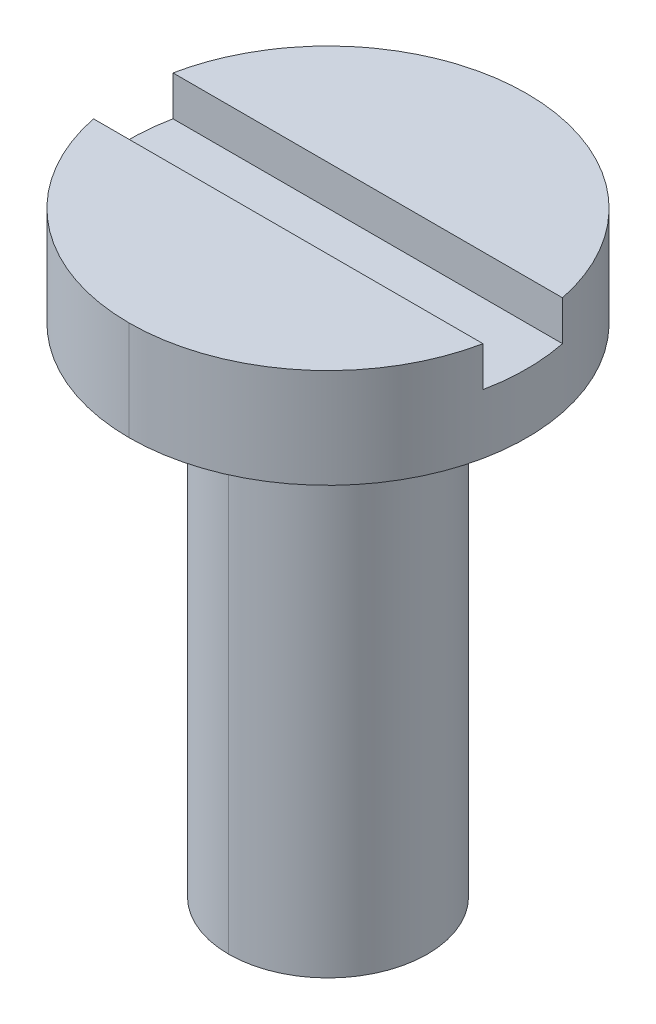
ISO-10303-21;
HEADER;
FILE_DESCRIPTION(('STEP AP214'),'2;1');
FILE_NAME('part.step','',(''),(''),'','','');
FILE_SCHEMA(('AUTOMOTIVE_DESIGN { 1 0 10303 214 1 1 1 1 }'));
ENDSEC;
DATA;
#1=APPLICATION_CONTEXT('core data for automotive mechanical design processes');
#2=APPLICATION_PROTOCOL_DEFINITION('international standard','automotive_design',2000,#1);
#3=PRODUCT_CONTEXT('',#1,'mechanical');
#4=PRODUCT('Part','Part','',(#3));
#5=PRODUCT_RELATED_PRODUCT_CATEGORY('part','',(#4));
#6=PRODUCT_DEFINITION_FORMATION('','',#4);
#7=PRODUCT_DEFINITION_CONTEXT('part definition',#1,'design');
#8=PRODUCT_DEFINITION('design','',#6,#7);
#9=PRODUCT_DEFINITION_SHAPE('','',#8);
#10=(LENGTH_UNIT() NAMED_UNIT(*) SI_UNIT(.MILLI.,.METRE.));
#11=(NAMED_UNIT(*) PLANE_ANGLE_UNIT() SI_UNIT($,.RADIAN.));
#12=(NAMED_UNIT(*) SI_UNIT($,.STERADIAN.) SOLID_ANGLE_UNIT());
#13=UNCERTAINTY_MEASURE_WITH_UNIT(LENGTH_MEASURE(1.E-05),#10,'distance_accuracy_value','');
#14=(GEOMETRIC_REPRESENTATION_CONTEXT(3) GLOBAL_UNCERTAINTY_ASSIGNED_CONTEXT((#13)) GLOBAL_UNIT_ASSIGNED_CONTEXT((#10,
#11,#12)) REPRESENTATION_CONTEXT('',''));
#15=CARTESIAN_POINT('',(0.,0.,0.));
#16=DIRECTION('',(0.,0.,1.));
#17=DIRECTION('',(1.,0.,0.));
#18=AXIS2_PLACEMENT_3D('',#15,#16,#17);
#19=CARTESIAN_POINT('',(-1.012,0.,0.));
#20=DIRECTION('',(0.,1.,0.));
#21=DIRECTION('',(1.,0.,0.));
#22=AXIS2_PLACEMENT_3D('',#19,#20,#21);
#23=PLANE('',#22);
#24=CARTESIAN_POINT('',(0.,0.,0.));
#25=DIRECTION('',(0.,1.,0.));
#26=DIRECTION('',(0.,0.,-1.));
#27=AXIS2_PLACEMENT_3D('',#24,#25,#26);
#28=CIRCLE('',#27,1.);
#29=CARTESIAN_POINT('',(0.,0.,-1.));
#30=VERTEX_POINT('',#29);
#31=CARTESIAN_POINT('',(0.,0.,1.));
#32=VERTEX_POINT('',#31);
#33=EDGE_CURVE('E46',#30,#32,#28,.T.);
#34=ORIENTED_EDGE('',*,*,#33,.F.);
#35=CARTESIAN_POINT('',(0.,0.,0.));
#36=DIRECTION('',(0.,1.,0.));
#37=DIRECTION('',(0.,0.,1.));
#38=AXIS2_PLACEMENT_3D('',#35,#36,#37);
#39=CIRCLE('',#38,1.);
#40=EDGE_CURVE('E302',#32,#30,#39,.T.);
#41=ORIENTED_EDGE('',*,*,#40,.F.);
#42=EDGE_LOOP('',(#34,#41));
#43=FACE_BOUND('',#42,.T.);
#44=ADVANCED_FACE('F16',(#43),#23,.F.);
#45=CARTESIAN_POINT('',(0.,2.5,0.));
#46=DIRECTION('',(0.,-1.,0.));
#47=DIRECTION('',(0.,0.,-1.));
#48=AXIS2_PLACEMENT_3D('',#45,#46,#47);
#49=CYLINDRICAL_SURFACE('',#48,1.);
#50=CARTESIAN_POINT('',(0.,0.,-1.));
#51=DIRECTION('',(0.,1.,0.));
#52=VECTOR('',#51,1.);
#53=LINE('',#50,#52);
#54=CARTESIAN_POINT('',(0.,5.,-1.));
#55=VERTEX_POINT('',#54);
#56=EDGE_CURVE('E294',#30,#55,#53,.T.);
#57=ORIENTED_EDGE('',*,*,#56,.F.);
#58=ORIENTED_EDGE('',*,*,#33,.T.);
#59=CARTESIAN_POINT('',(0.,5.,1.));
#60=DIRECTION('',(0.,-1.,0.));
#61=VECTOR('',#60,1.);
#62=LINE('',#59,#61);
#63=CARTESIAN_POINT('',(0.,5.,1.));
#64=VERTEX_POINT('',#63);
#65=EDGE_CURVE('E309',#64,#32,#62,.T.);
#66=ORIENTED_EDGE('',*,*,#65,.F.);
#67=CARTESIAN_POINT('',(0.,5.,0.));
#68=DIRECTION('',(0.,-1.,0.));
#69=DIRECTION('',(0.,0.,1.));
#70=AXIS2_PLACEMENT_3D('',#67,#68,#69);
#71=CIRCLE('',#70,1.);
#72=EDGE_CURVE('E35',#64,#55,#71,.T.);
#73=ORIENTED_EDGE('',*,*,#72,.T.);
#74=EDGE_LOOP('',(#57,#58,#66,#73));
#75=FACE_BOUND('',#74,.T.);
#76=ADVANCED_FACE('F351',(#75),#49,.T.);
#77=CARTESIAN_POINT('',(0.,2.5,0.));
#78=DIRECTION('',(0.,-1.,0.));
#79=DIRECTION('',(0.,0.,-1.));
#80=AXIS2_PLACEMENT_3D('',#77,#78,#79);
#81=CYLINDRICAL_SURFACE('',#80,1.);
#82=ORIENTED_EDGE('',*,*,#40,.T.);
#83=ORIENTED_EDGE('',*,*,#56,.T.);
#84=CARTESIAN_POINT('',(0.,5.,0.));
#85=DIRECTION('',(0.,-1.,0.));
#86=DIRECTION('',(0.,0.,-1.));
#87=AXIS2_PLACEMENT_3D('',#84,#85,#86);
#88=CIRCLE('',#87,1.);
#89=EDGE_CURVE('E287',#55,#64,#88,.T.);
#90=ORIENTED_EDGE('',*,*,#89,.T.);
#91=ORIENTED_EDGE('',*,*,#65,.T.);
#92=EDGE_LOOP('',(#82,#83,#90,#91));
#93=FACE_BOUND('',#92,.T.);
#94=ADVANCED_FACE('F355',(#93),#81,.T.);
#95=CARTESIAN_POINT('',(-1.983106896,6.,1.2048));
#96=DIRECTION('',(0.,1.,0.));
#97=DIRECTION('',(1.,0.,0.));
#98=AXIS2_PLACEMENT_3D('',#95,#96,#97);
#99=PLANE('',#98);
#100=CARTESIAN_POINT('',(1.95959179421749,6.,0.4));
#101=DIRECTION('',(-1.,0.,0.));
#102=VECTOR('',#101,1.);
#103=LINE('',#100,#102);
#104=CARTESIAN_POINT('',(1.9595917941465,6.,0.400000000014792));
#105=VERTEX_POINT('',#104);
#106=CARTESIAN_POINT('',(-1.95959179411025,6.,0.400000000014803));
#107=VERTEX_POINT('',#106);
#108=EDGE_CURVE('E120',#105,#107,#103,.T.);
#109=ORIENTED_EDGE('',*,*,#108,.T.);
#110=CARTESIAN_POINT('',(0.,6.,0.));
#111=DIRECTION('',(0.,-1.,0.));
#112=DIRECTION('',(0.,0.,1.));
#113=AXIS2_PLACEMENT_3D('',#110,#111,#112);
#114=CIRCLE('',#113,2.);
#115=CARTESIAN_POINT('',(0.,6.,2.));
#116=VERTEX_POINT('',#115);
#117=EDGE_CURVE('E78',#116,#107,#114,.T.);
#118=ORIENTED_EDGE('',*,*,#117,.F.);
#119=CARTESIAN_POINT('',(0.,6.,0.));
#120=DIRECTION('',(0.,-1.,0.));
#121=DIRECTION('',(0.979795897113272,0.,0.199999999999998));
#122=AXIS2_PLACEMENT_3D('',#119,#120,#121);
#123=CIRCLE('',#122,2.);
#124=EDGE_CURVE('E217',#105,#116,#123,.T.);
#125=ORIENTED_EDGE('',*,*,#124,.F.);
#126=EDGE_LOOP('',(#109,#118,#125));
#127=FACE_BOUND('',#126,.T.);
#128=ADVANCED_FACE('F228',(#127),#99,.T.);
#129=CARTESIAN_POINT('',(-2.024,5.,0.));
#130=DIRECTION('',(0.,1.,0.));
#131=DIRECTION('',(1.,0.,0.));
#132=AXIS2_PLACEMENT_3D('',#129,#130,#131);
#133=PLANE('',#132);
#134=ORIENTED_EDGE('',*,*,#72,.F.);
#135=ORIENTED_EDGE('',*,*,#89,.F.);
#136=EDGE_LOOP('',(#134,#135));
#137=FACE_BOUND('',#136,.T.);
#138=CARTESIAN_POINT('',(0.,5.,0.));
#139=DIRECTION('',(0.,1.,0.));
#140=DIRECTION('',(0.,0.,-1.));
#141=AXIS2_PLACEMENT_3D('',#138,#139,#140);
#142=CIRCLE('',#141,2.);
#143=CARTESIAN_POINT('',(0.,5.,-2.));
#144=VERTEX_POINT('',#143);
#145=CARTESIAN_POINT('',(0.,5.,2.));
#146=VERTEX_POINT('',#145);
#147=EDGE_CURVE('E274',#144,#146,#142,.T.);
#148=ORIENTED_EDGE('',*,*,#147,.F.);
#149=CARTESIAN_POINT('',(0.,5.,0.));
#150=DIRECTION('',(0.,1.,0.));
#151=DIRECTION('',(0.,0.,1.));
#152=AXIS2_PLACEMENT_3D('',#149,#150,#151);
#153=CIRCLE('',#152,2.);
#154=EDGE_CURVE('E202',#146,#144,#153,.T.);
#155=ORIENTED_EDGE('',*,*,#154,.F.);
#156=EDGE_LOOP('',(#148,#155));
#157=FACE_BOUND('',#156,.T.);
#158=ADVANCED_FACE('F385',(#137,#157),#133,.F.);
#159=CARTESIAN_POINT('',(0.,5.5,0.));
#160=DIRECTION('',(0.,-1.,0.));
#161=DIRECTION('',(0.,0.,-1.));
#162=AXIS2_PLACEMENT_3D('',#159,#160,#161);
#163=CYLINDRICAL_SURFACE('',#162,2.);
#164=CARTESIAN_POINT('',(0.,5.,-2.));
#165=DIRECTION('',(0.,1.,0.));
#166=VECTOR('',#165,1.);
#167=LINE('',#164,#166);
#168=CARTESIAN_POINT('',(7.55166624584581E-12,6.,-2.));
#169=VERTEX_POINT('',#168);
#170=EDGE_CURVE('E192',#144,#169,#167,.T.);
#171=ORIENTED_EDGE('',*,*,#170,.F.);
#172=ORIENTED_EDGE('',*,*,#147,.T.);
#173=CARTESIAN_POINT('',(0.,6.,2.));
#174=DIRECTION('',(0.,-1.,0.));
#175=VECTOR('',#174,1.);
#176=LINE('',#173,#175);
#177=EDGE_CURVE('E209',#116,#146,#176,.T.);
#178=ORIENTED_EDGE('',*,*,#177,.F.);
#179=ORIENTED_EDGE('',*,*,#117,.T.);
#180=CARTESIAN_POINT('',(-1.95959179421748,6.,0.400000000044384));
#181=DIRECTION('',(0.,-1.,0.));
#182=VECTOR('',#181,1.);
#183=LINE('',#180,#182);
#184=CARTESIAN_POINT('',(-1.95959179411176,5.6,0.4000000000074));
#185=VERTEX_POINT('',#184);
#186=EDGE_CURVE('E84',#107,#185,#183,.T.);
#187=ORIENTED_EDGE('',*,*,#186,.T.);
#188=CARTESIAN_POINT('',(0.,5.6,0.));
#189=DIRECTION('',(0.,-1.,0.));
#190=DIRECTION('',(-0.979795897113271,0.,0.199999999999999));
#191=AXIS2_PLACEMENT_3D('',#188,#189,#190);
#192=CIRCLE('',#191,2.);
#193=CARTESIAN_POINT('',(-1.95959179412105,5.6,-0.400000000100359));
#194=VERTEX_POINT('',#193);
#195=EDGE_CURVE('E115',#185,#194,#192,.T.);
#196=ORIENTED_EDGE('',*,*,#195,.T.);
#197=CARTESIAN_POINT('',(-1.95959179421748,5.6,-0.400000000044384));
#198=DIRECTION('',(0.,1.,0.));
#199=VECTOR('',#198,1.);
#200=LINE('',#197,#199);
#201=CARTESIAN_POINT('',(-1.95959179414649,6.,-0.400000000014803));
#202=VERTEX_POINT('',#201);
#203=EDGE_CURVE('E58',#194,#202,#200,.T.);
#204=ORIENTED_EDGE('',*,*,#203,.T.);
#205=CARTESIAN_POINT('',(1.95959179422655,6.,-0.4));
#206=CARTESIAN_POINT('',(1.89049982818501,6.,-0.738480124254906));
#207=CARTESIAN_POINT('',(1.7115828940194,6.,-1.03464196556112));
#208=CARTESIAN_POINT('',(1.53308842599534,6.,-1.33010449715159));
#209=CARTESIAN_POINT('',(1.26491106407612,6.,-1.5491933384758));
#210=CARTESIAN_POINT('',(0.997585567132615,6.,-1.76758624443411));
#211=CARTESIAN_POINT('',(0.671421374055465,6.,-1.88393029023408));
#212=CARTESIAN_POINT('',(0.3462932410333,6.,-1.99990476935246));
#213=CARTESIAN_POINT('',(2.26550549153881E-11,6.,-2.));
#214=CARTESIAN_POINT('',(-0.345193241043465,6.,-2.00009492814753));
#215=CARTESIAN_POINT('',(-0.671421374012782,6.,-1.88393029024929));
#216=CARTESIAN_POINT('',(-0.996613243821795,6.,-1.76813464914384));
#217=CARTESIAN_POINT('',(-1.26491106404103,6.,-1.54919333850446));
#218=CARTESIAN_POINT('',(-1.53235663664896,6.,-1.33094749459997));
#219=CARTESIAN_POINT('',(-1.71158289399596,6.,-1.0346419655999));
#220=CARTESIAN_POINT('',(-1.8903865407918,6.,-0.739035116831021));
#221=CARTESIAN_POINT('',(-1.95959179421748,6.,-0.400000000044393));
#222=B_SPLINE_CURVE_WITH_KNOTS('',2,(#205,#206,#207,#208,#209,#210,#211,#212,#213,#214,#215,
#216,#217,#218,#219,#220,#221),.UNSPECIFIED.,.F.,.F.,(3,2,2,2,2,2,2,2,3),(0.,0.125,0.25,0.375,
0.5,0.625,0.75,0.875,1.),.UNSPECIFIED.);
#223=EDGE_CURVE('E270',#169,#202,#222,.T.);
#224=ORIENTED_EDGE('',*,*,#223,.F.);
#225=EDGE_LOOP('',(#171,#172,#178,#179,#187,#196,#204,#224));
#226=FACE_BOUND('',#225,.T.);
#227=ADVANCED_FACE('F395',(#226),#163,.T.);
#228=CARTESIAN_POINT('',(-1.983106896,6.,-1.2048));
#229=DIRECTION('',(0.,1.,0.));
#230=DIRECTION('',(1.,0.,0.));
#231=AXIS2_PLACEMENT_3D('',#228,#229,#230);
#232=PLANE('',#231);
#233=CARTESIAN_POINT('',(-1.95959179421748,6.,-0.4));
#234=DIRECTION('',(1.,0.,0.));
#235=VECTOR('',#234,1.);
#236=LINE('',#233,#235);
#237=CARTESIAN_POINT('',(1.95959179411025,6.,-0.400000000014792));
#238=VERTEX_POINT('',#237);
#239=EDGE_CURVE('E96',#202,#238,#236,.T.);
#240=ORIENTED_EDGE('',*,*,#239,.T.);
#241=CARTESIAN_POINT('',(0.,6.,0.));
#242=DIRECTION('',(0.,-1.,0.));
#243=DIRECTION('',(0.,0.,-1.));
#244=AXIS2_PLACEMENT_3D('',#241,#242,#243);
#245=CIRCLE('',#244,2.);
#246=EDGE_CURVE('E189',#169,#238,#245,.T.);
#247=ORIENTED_EDGE('',*,*,#246,.F.);
#248=ORIENTED_EDGE('',*,*,#223,.T.);
#249=EDGE_LOOP('',(#240,#247,#248));
#250=FACE_BOUND('',#249,.T.);
#251=ADVANCED_FACE('F408',(#250),#232,.T.);
#252=CARTESIAN_POINT('',(0.,5.6,-0.4));
#253=DIRECTION('',(0.,0.,-1.));
#254=DIRECTION('',(0.,-1.,0.));
#255=AXIS2_PLACEMENT_3D('',#252,#253,#254);
#256=PLANE('',#255);
#257=ORIENTED_EDGE('',*,*,#203,.F.);
#258=CARTESIAN_POINT('',(-1.959591794,5.6,-0.4));
#259=DIRECTION('',(1.,0.,0.));
#260=VECTOR('',#259,1.);
#261=LINE('',#258,#260);
#262=CARTESIAN_POINT('',(1.95959179411177,5.6,-0.400000000007391));
#263=VERTEX_POINT('',#262);
#264=EDGE_CURVE('E102',#194,#263,#261,.T.);
#265=ORIENTED_EDGE('',*,*,#264,.T.);
#266=CARTESIAN_POINT('',(1.95959179421748,6.,-0.400000000044393));
#267=DIRECTION('',(0.,-1.,0.));
#268=VECTOR('',#267,1.);
#269=LINE('',#266,#268);
#270=EDGE_CURVE('E135',#238,#263,#269,.T.);
#271=ORIENTED_EDGE('',*,*,#270,.F.);
#272=ORIENTED_EDGE('',*,*,#239,.F.);
#273=EDGE_LOOP('',(#257,#265,#271,#272));
#274=FACE_BOUND('',#273,.T.);
#275=ADVANCED_FACE('F419',(#274),#256,.F.);
#276=CARTESIAN_POINT('',(-2.024,5.6,0.));
#277=DIRECTION('',(0.,-1.,0.));
#278=DIRECTION('',(0.,0.,-1.));
#279=AXIS2_PLACEMENT_3D('',#276,#277,#278);
#280=PLANE('',#279);
#281=ORIENTED_EDGE('',*,*,#195,.F.);
#282=CARTESIAN_POINT('',(-1.959591794,5.6,0.4));
#283=DIRECTION('',(1.,0.,0.));
#284=VECTOR('',#283,1.);
#285=LINE('',#282,#284);
#286=CARTESIAN_POINT('',(1.95959179412105,5.6,0.400000000100367));
#287=VERTEX_POINT('',#286);
#288=EDGE_CURVE('E108',#185,#287,#285,.T.);
#289=ORIENTED_EDGE('',*,*,#288,.T.);
#290=CARTESIAN_POINT('',(0.,5.6,0.));
#291=DIRECTION('',(0.,-1.,0.));
#292=DIRECTION('',(0.979795897113273,0.,-0.19999999999999));
#293=AXIS2_PLACEMENT_3D('',#290,#291,#292);
#294=CIRCLE('',#293,2.);
#295=EDGE_CURVE('E27',#263,#287,#294,.T.);
#296=ORIENTED_EDGE('',*,*,#295,.F.);
#297=ORIENTED_EDGE('',*,*,#264,.F.);
#298=EDGE_LOOP('',(#281,#289,#296,#297));
#299=FACE_BOUND('',#298,.T.);
#300=ADVANCED_FACE('F111',(#299),#280,.F.);
#301=CARTESIAN_POINT('',(0.,5.6,0.4));
#302=DIRECTION('',(0.,0.,1.));
#303=DIRECTION('',(1.,0.,0.));
#304=AXIS2_PLACEMENT_3D('',#301,#302,#303);
#305=PLANE('',#304);
#306=CARTESIAN_POINT('',(1.95959179421748,5.6,0.40000000004439));
#307=DIRECTION('',(0.,1.,0.));
#308=VECTOR('',#307,1.);
#309=LINE('',#306,#308);
#310=EDGE_CURVE('E11',#287,#105,#309,.T.);
#311=ORIENTED_EDGE('',*,*,#310,.F.);
#312=ORIENTED_EDGE('',*,*,#288,.F.);
#313=ORIENTED_EDGE('',*,*,#186,.F.);
#314=ORIENTED_EDGE('',*,*,#108,.F.);
#315=EDGE_LOOP('',(#311,#312,#313,#314));
#316=FACE_BOUND('',#315,.T.);
#317=ADVANCED_FACE('F125',(#316),#305,.F.);
#318=CARTESIAN_POINT('',(0.,5.5,0.));
#319=DIRECTION('',(0.,-1.,0.));
#320=DIRECTION('',(0.,0.,-1.));
#321=AXIS2_PLACEMENT_3D('',#318,#319,#320);
#322=CYLINDRICAL_SURFACE('',#321,2.);
#323=ORIENTED_EDGE('',*,*,#295,.T.);
#324=ORIENTED_EDGE('',*,*,#310,.T.);
#325=ORIENTED_EDGE('',*,*,#124,.T.);
#326=ORIENTED_EDGE('',*,*,#177,.T.);
#327=ORIENTED_EDGE('',*,*,#154,.T.);
#328=ORIENTED_EDGE('',*,*,#170,.T.);
#329=ORIENTED_EDGE('',*,*,#246,.T.);
#330=ORIENTED_EDGE('',*,*,#270,.T.);
#331=EDGE_LOOP('',(#323,#324,#325,#326,#327,#328,#329,#330));
#332=FACE_BOUND('',#331,.T.);
#333=ADVANCED_FACE('F133',(#332),#322,.T.);
#334=CLOSED_SHELL('',(#44,#76,#94,#128,#158,#227,#251,#275,#300,#317,#333));
#335=MANIFOLD_SOLID_BREP('B1',#334);
#336=ADVANCED_BREP_SHAPE_REPRESENTATION('',(#18,#335),#14);
#337=SHAPE_DEFINITION_REPRESENTATION(#9,#336);
ENDSEC;
END-ISO-10303-21;
